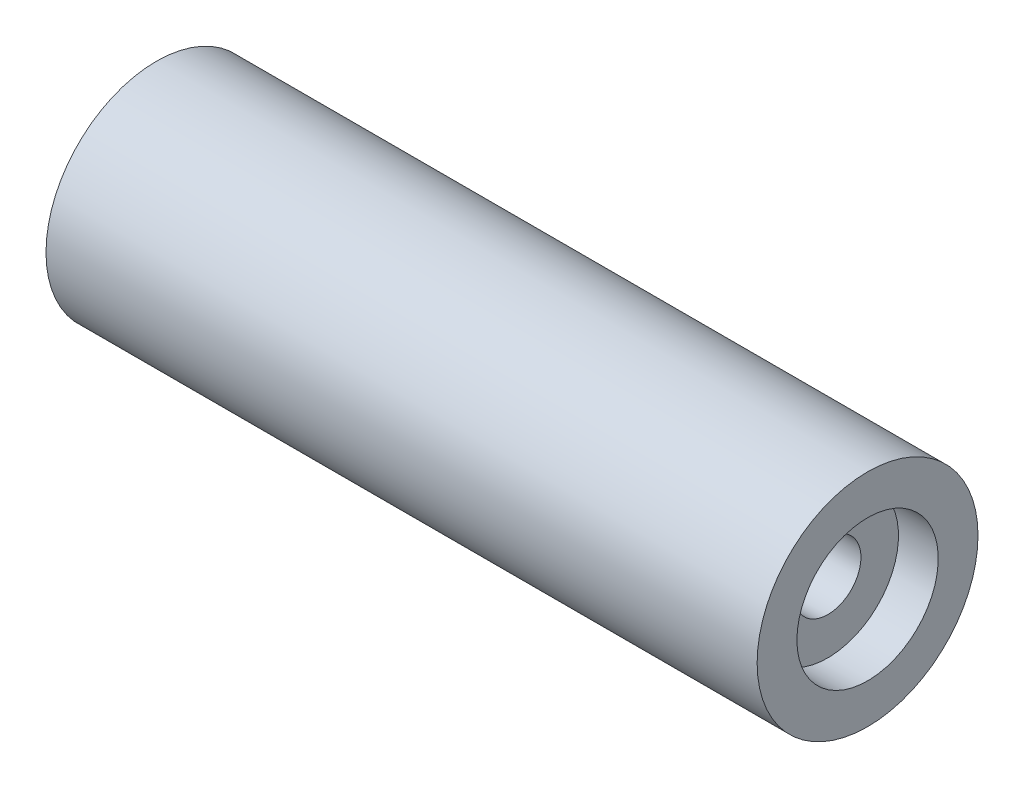
ISO-10303-21;
HEADER;
FILE_DESCRIPTION(('STEP AP214'),'2;1');
FILE_NAME('part.step','',(''),(''),'','','');
FILE_SCHEMA(('AUTOMOTIVE_DESIGN { 1 0 10303 214 1 1 1 1 }'));
ENDSEC;
DATA;
#1=APPLICATION_CONTEXT('core data for automotive mechanical design processes');
#2=APPLICATION_PROTOCOL_DEFINITION('international standard','automotive_design',2000,#1);
#3=PRODUCT_CONTEXT('',#1,'mechanical');
#4=PRODUCT('Part','Part','',(#3));
#5=PRODUCT_RELATED_PRODUCT_CATEGORY('part','',(#4));
#6=PRODUCT_DEFINITION_FORMATION('','',#4);
#7=PRODUCT_DEFINITION_CONTEXT('part definition',#1,'design');
#8=PRODUCT_DEFINITION('design','',#6,#7);
#9=PRODUCT_DEFINITION_SHAPE('','',#8);
#10=(LENGTH_UNIT() NAMED_UNIT(*) SI_UNIT(.MILLI.,.METRE.));
#11=(NAMED_UNIT(*) PLANE_ANGLE_UNIT() SI_UNIT($,.RADIAN.));
#12=(NAMED_UNIT(*) SI_UNIT($,.STERADIAN.) SOLID_ANGLE_UNIT());
#13=UNCERTAINTY_MEASURE_WITH_UNIT(LENGTH_MEASURE(1.E-05),#10,'distance_accuracy_value','');
#14=(GEOMETRIC_REPRESENTATION_CONTEXT(3) GLOBAL_UNCERTAINTY_ASSIGNED_CONTEXT((#13)) GLOBAL_UNIT_ASSIGNED_CONTEXT((#10,
#11,#12)) REPRESENTATION_CONTEXT('',''));
#15=CARTESIAN_POINT('',(0.,0.,0.));
#16=DIRECTION('',(0.,0.,1.));
#17=DIRECTION('',(1.,0.,0.));
#18=AXIS2_PLACEMENT_3D('',#15,#16,#17);
#19=CARTESIAN_POINT('',(80.5,0.,0.));
#20=DIRECTION('',(-1.,0.,0.));
#21=DIRECTION('',(0.,0.,1.));
#22=AXIS2_PLACEMENT_3D('',#19,#20,#21);
#23=CYLINDRICAL_SURFACE('',#22,7.5);
#24=CARTESIAN_POINT('',(-71.5,0.,0.));
#25=DIRECTION('',(-1.,0.,0.));
#26=DIRECTION('',(0.,0.,1.));
#27=AXIS2_PLACEMENT_3D('',#24,#25,#26);
#28=CIRCLE('',#27,7.5);
#29=CARTESIAN_POINT('',(-71.5,0.,7.5));
#30=VERTEX_POINT('',#29);
#31=EDGE_CURVE('E47',#30,#30,#28,.T.);
#32=ORIENTED_EDGE('',*,*,#31,.T.);
#33=EDGE_LOOP('',(#32));
#34=FACE_BOUND('',#33,.T.);
#35=CARTESIAN_POINT('',(71.5,0.,0.));
#36=DIRECTION('',(1.,0.,0.));
#37=DIRECTION('',(0.,0.,-1.));
#38=AXIS2_PLACEMENT_3D('',#35,#36,#37);
#39=CIRCLE('',#38,7.5);
#40=CARTESIAN_POINT('',(71.5,0.,-7.5));
#41=VERTEX_POINT('',#40);
#42=EDGE_CURVE('E38',#41,#41,#39,.T.);
#43=ORIENTED_EDGE('',*,*,#42,.T.);
#44=EDGE_LOOP('',(#43));
#45=FACE_BOUND('',#44,.T.);
#46=ADVANCED_FACE('F34',(#34,#45),#23,.F.);
#47=CARTESIAN_POINT('',(80.5,0.,0.));
#48=DIRECTION('',(1.,0.,0.));
#49=DIRECTION('',(0.,0.,-1.));
#50=AXIS2_PLACEMENT_3D('',#47,#48,#49);
#51=PLANE('',#50);
#52=CARTESIAN_POINT('',(80.5,0.,0.));
#53=DIRECTION('',(-1.,0.,0.));
#54=DIRECTION('',(0.,0.,1.));
#55=AXIS2_PLACEMENT_3D('',#52,#53,#54);
#56=CIRCLE('',#55,16.);
#57=CARTESIAN_POINT('',(80.5,0.,16.));
#58=VERTEX_POINT('',#57);
#59=EDGE_CURVE('E61',#58,#58,#56,.T.);
#60=ORIENTED_EDGE('',*,*,#59,.T.);
#61=EDGE_LOOP('',(#60));
#62=FACE_BOUND('',#61,.T.);
#63=CARTESIAN_POINT('',(80.5,0.,0.));
#64=DIRECTION('',(1.,0.,0.));
#65=DIRECTION('',(0.,0.,-1.));
#66=AXIS2_PLACEMENT_3D('',#63,#64,#65);
#67=CIRCLE('',#66,25.);
#68=CARTESIAN_POINT('',(80.5,0.,-25.));
#69=VERTEX_POINT('',#68);
#70=EDGE_CURVE('E10',#69,#69,#67,.T.);
#71=ORIENTED_EDGE('',*,*,#70,.T.);
#72=EDGE_LOOP('',(#71));
#73=FACE_BOUND('',#72,.T.);
#74=ADVANCED_FACE('F83',(#62,#73),#51,.T.);
#75=CARTESIAN_POINT('',(-80.5,0.,0.));
#76=DIRECTION('',(1.,0.,0.));
#77=DIRECTION('',(0.,0.,-1.));
#78=AXIS2_PLACEMENT_3D('',#75,#76,#77);
#79=PLANE('',#78);
#80=CARTESIAN_POINT('',(-80.5,0.,0.));
#81=DIRECTION('',(-1.,0.,0.));
#82=DIRECTION('',(0.,0.,1.));
#83=AXIS2_PLACEMENT_3D('',#80,#81,#82);
#84=CIRCLE('',#83,16.);
#85=CARTESIAN_POINT('',(-80.5,0.,16.));
#86=VERTEX_POINT('',#85);
#87=EDGE_CURVE('E50',#86,#86,#84,.T.);
#88=ORIENTED_EDGE('',*,*,#87,.F.);
#89=EDGE_LOOP('',(#88));
#90=FACE_BOUND('',#89,.T.);
#91=CARTESIAN_POINT('',(-80.5,0.,0.));
#92=DIRECTION('',(1.,0.,0.));
#93=DIRECTION('',(0.,0.,-1.));
#94=AXIS2_PLACEMENT_3D('',#91,#92,#93);
#95=CIRCLE('',#94,25.);
#96=CARTESIAN_POINT('',(-80.5,0.,-25.));
#97=VERTEX_POINT('',#96);
#98=EDGE_CURVE('E42',#97,#97,#95,.T.);
#99=ORIENTED_EDGE('',*,*,#98,.F.);
#100=EDGE_LOOP('',(#99));
#101=FACE_BOUND('',#100,.T.);
#102=ADVANCED_FACE('F88',(#90,#101),#79,.F.);
#103=CARTESIAN_POINT('',(80.5,0.,0.));
#104=DIRECTION('',(-1.,0.,0.));
#105=DIRECTION('',(0.,0.,1.));
#106=AXIS2_PLACEMENT_3D('',#103,#104,#105);
#107=CYLINDRICAL_SURFACE('',#106,25.);
#108=ORIENTED_EDGE('',*,*,#70,.F.);
#109=EDGE_LOOP('',(#108));
#110=FACE_BOUND('',#109,.T.);
#111=ORIENTED_EDGE('',*,*,#98,.T.);
#112=EDGE_LOOP('',(#111));
#113=FACE_BOUND('',#112,.T.);
#114=ADVANCED_FACE('F36',(#110,#113),#107,.T.);
#115=CARTESIAN_POINT('',(-71.5,0.,0.));
#116=DIRECTION('',(-1.,0.,0.));
#117=DIRECTION('',(0.,0.,1.));
#118=AXIS2_PLACEMENT_3D('',#115,#116,#117);
#119=CYLINDRICAL_SURFACE('',#118,16.);
#120=CARTESIAN_POINT('',(-71.5,0.,0.));
#121=DIRECTION('',(-1.,0.,0.));
#122=DIRECTION('',(0.,0.,1.));
#123=AXIS2_PLACEMENT_3D('',#120,#121,#122);
#124=CIRCLE('',#123,16.);
#125=CARTESIAN_POINT('',(-71.5,0.,16.));
#126=VERTEX_POINT('',#125);
#127=EDGE_CURVE('E53',#126,#126,#124,.T.);
#128=ORIENTED_EDGE('',*,*,#127,.F.);
#129=EDGE_LOOP('',(#128));
#130=FACE_BOUND('',#129,.T.);
#131=ORIENTED_EDGE('',*,*,#87,.T.);
#132=EDGE_LOOP('',(#131));
#133=FACE_BOUND('',#132,.T.);
#134=ADVANCED_FACE('F92',(#130,#133),#119,.F.);
#135=CARTESIAN_POINT('',(-71.5,0.,0.));
#136=DIRECTION('',(-1.,0.,0.));
#137=DIRECTION('',(0.,0.,1.));
#138=AXIS2_PLACEMENT_3D('',#135,#136,#137);
#139=PLANE('',#138);
#140=ORIENTED_EDGE('',*,*,#31,.F.);
#141=EDGE_LOOP('',(#140));
#142=FACE_BOUND('',#141,.T.);
#143=ORIENTED_EDGE('',*,*,#127,.T.);
#144=EDGE_LOOP('',(#143));
#145=FACE_BOUND('',#144,.T.);
#146=ADVANCED_FACE('F80',(#142,#145),#139,.T.);
#147=CARTESIAN_POINT('',(71.5,0.,0.));
#148=DIRECTION('',(1.,0.,0.));
#149=DIRECTION('',(0.,0.,-1.));
#150=AXIS2_PLACEMENT_3D('',#147,#148,#149);
#151=CYLINDRICAL_SURFACE('',#150,16.);
#152=CARTESIAN_POINT('',(71.5,0.,0.));
#153=DIRECTION('',(-1.,0.,0.));
#154=DIRECTION('',(0.,0.,1.));
#155=AXIS2_PLACEMENT_3D('',#152,#153,#154);
#156=CIRCLE('',#155,16.);
#157=CARTESIAN_POINT('',(71.5,0.,16.));
#158=VERTEX_POINT('',#157);
#159=EDGE_CURVE('E64',#158,#158,#156,.T.);
#160=ORIENTED_EDGE('',*,*,#159,.T.);
#161=EDGE_LOOP('',(#160));
#162=FACE_BOUND('',#161,.T.);
#163=ORIENTED_EDGE('',*,*,#59,.F.);
#164=EDGE_LOOP('',(#163));
#165=FACE_BOUND('',#164,.T.);
#166=ADVANCED_FACE('F75',(#162,#165),#151,.F.);
#167=CARTESIAN_POINT('',(71.5,0.,0.));
#168=DIRECTION('',(1.,0.,0.));
#169=DIRECTION('',(0.,0.,1.));
#170=AXIS2_PLACEMENT_3D('',#167,#168,#169);
#171=PLANE('',#170);
#172=ORIENTED_EDGE('',*,*,#42,.F.);
#173=EDGE_LOOP('',(#172));
#174=FACE_BOUND('',#173,.T.);
#175=ORIENTED_EDGE('',*,*,#159,.F.);
#176=EDGE_LOOP('',(#175));
#177=FACE_BOUND('',#176,.T.);
#178=ADVANCED_FACE('F72',(#174,#177),#171,.T.);
#179=CLOSED_SHELL('',(#46,#74,#102,#114,#134,#146,#166,#178));
#180=MANIFOLD_SOLID_BREP('B2',#179);
#181=ADVANCED_BREP_SHAPE_REPRESENTATION('',(#18,#180),#14);
#182=SHAPE_DEFINITION_REPRESENTATION(#9,#181);
ENDSEC;
END-ISO-10303-21;
